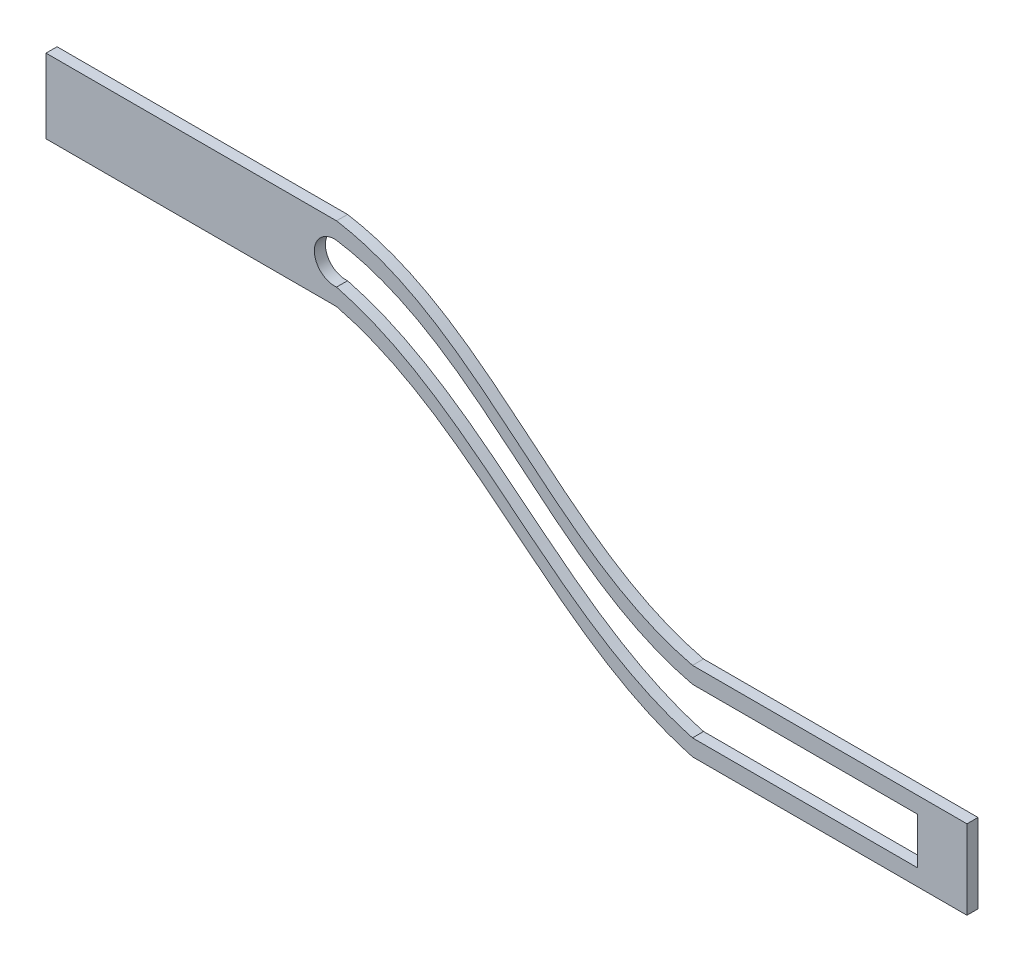
ISO-10303-21;
HEADER;
FILE_DESCRIPTION(('STEP AP214'),'2;1');
FILE_NAME('part.step','',(''),(''),'','','');
FILE_SCHEMA(('AUTOMOTIVE_DESIGN { 1 0 10303 214 1 1 1 1 }'));
ENDSEC;
DATA;
#1=APPLICATION_CONTEXT('core data for automotive mechanical design processes');
#2=APPLICATION_PROTOCOL_DEFINITION('international standard','automotive_design',2000,#1);
#3=PRODUCT_CONTEXT('',#1,'mechanical');
#4=PRODUCT('Part','Part','',(#3));
#5=PRODUCT_RELATED_PRODUCT_CATEGORY('part','',(#4));
#6=PRODUCT_DEFINITION_FORMATION('','',#4);
#7=PRODUCT_DEFINITION_CONTEXT('part definition',#1,'design');
#8=PRODUCT_DEFINITION('design','',#6,#7);
#9=PRODUCT_DEFINITION_SHAPE('','',#8);
#10=(LENGTH_UNIT() NAMED_UNIT(*) SI_UNIT(.MILLI.,.METRE.));
#11=(NAMED_UNIT(*) PLANE_ANGLE_UNIT() SI_UNIT($,.RADIAN.));
#12=(NAMED_UNIT(*) SI_UNIT($,.STERADIAN.) SOLID_ANGLE_UNIT());
#13=UNCERTAINTY_MEASURE_WITH_UNIT(LENGTH_MEASURE(1.E-05),#10,'distance_accuracy_value','');
#14=(GEOMETRIC_REPRESENTATION_CONTEXT(3) GLOBAL_UNCERTAINTY_ASSIGNED_CONTEXT((#13)) GLOBAL_UNIT_ASSIGNED_CONTEXT((#10,
#11,#12)) REPRESENTATION_CONTEXT('',''));
#15=CARTESIAN_POINT('',(0.,0.,0.));
#16=DIRECTION('',(0.,0.,1.));
#17=DIRECTION('',(1.,0.,0.));
#18=AXIS2_PLACEMENT_3D('',#15,#16,#17);
#19=CARTESIAN_POINT('',(-122.264976342082,9.57643260683997,3.8));
#20=DIRECTION('',(0.,0.,1.));
#21=DIRECTION('',(1.,0.,0.));
#22=AXIS2_PLACEMENT_3D('',#19,#20,#21);
#23=PLANE('',#22);
#24=CARTESIAN_POINT('',(-183.434400526854,45.6712423685026,3.8));
#25=CARTESIAN_POINT('',(-135.823073524928,33.7105717836941,3.8));
#26=CARTESIAN_POINT('',(-108.755954442638,-14.3126069948659,3.8));
#27=CARTESIAN_POINT('',(-60.9483263071004,-27.2536758802677,3.8));
#28=B_SPLINE_CURVE_WITH_KNOTS('',3,(#24,#25,#26,#27),.UNSPECIFIED.,.F.,.F.,(4,4),(0.,1.),.UNSPECIFIED.);
#29=CARTESIAN_POINT('',(-183.434400526854,45.6712423685026,3.8));
#30=VERTEX_POINT('',#29);
#31=CARTESIAN_POINT('',(-60.9483263071004,-27.2536758802677,3.8));
#32=VERTEX_POINT('',#31);
#33=EDGE_CURVE('E277',#30,#32,#28,.T.);
#34=ORIENTED_EDGE('',*,*,#33,.T.);
#35=DIRECTION('',(1.,0.,0.));
#36=VECTOR('',#35,1.);
#37=CARTESIAN_POINT('',(-60.9483263071004,-27.2536758802677,3.8));
#38=LINE('',#37,#36);
#39=CARTESIAN_POINT('',(33.4854762271632,-27.2536758802676,3.8));
#40=VERTEX_POINT('',#39);
#41=EDGE_CURVE('E325',#32,#40,#38,.T.);
#42=ORIENTED_EDGE('',*,*,#41,.T.);
#43=DIRECTION('',(0.,1.,0.));
#44=VECTOR('',#43,1.);
#45=CARTESIAN_POINT('',(33.4854762271632,-27.2536758802676,3.8));
#46=LINE('',#45,#44);
#47=CARTESIAN_POINT('',(33.4854762271632,0.,3.8));
#48=VERTEX_POINT('',#47);
#49=EDGE_CURVE('E308',#40,#48,#46,.T.);
#50=ORIENTED_EDGE('',*,*,#49,.T.);
#51=DIRECTION('',(-1.,0.,0.));
#52=VECTOR('',#51,1.);
#53=CARTESIAN_POINT('',(33.4854762271632,0.,3.8));
#54=LINE('',#53,#52);
#55=CARTESIAN_POINT('',(-60.9483263071006,0.,3.8));
#56=VERTEX_POINT('',#55);
#57=EDGE_CURVE('E229',#48,#56,#54,.T.);
#58=ORIENTED_EDGE('',*,*,#57,.T.);
#59=CARTESIAN_POINT('',(-60.9483263071006,0.,3.8));
#60=CARTESIAN_POINT('',(-109.10583805191,11.4344909669116,3.8));
#61=CARTESIAN_POINT('',(-134.596760432405,63.2419600110928,3.8));
#62=CARTESIAN_POINT('',(-183.434400526854,71.2181628076457,3.8));
#63=B_SPLINE_CURVE_WITH_KNOTS('',3,(#59,#60,#61,#62),.UNSPECIFIED.,.F.,.F.,(4,4),(0.,1.),.UNSPECIFIED.);
#64=CARTESIAN_POINT('',(-183.434400526854,71.2181628076457,3.8));
#65=VERTEX_POINT('',#64);
#66=EDGE_CURVE('E221',#56,#65,#63,.T.);
#67=ORIENTED_EDGE('',*,*,#66,.T.);
#68=DIRECTION('',(-1.,0.,0.));
#69=VECTOR('',#68,1.);
#70=CARTESIAN_POINT('',(-183.434400526854,71.2181628076457,3.8));
#71=LINE('',#70,#69);
#72=CARTESIAN_POINT('',(-283.388111119401,71.2181628076456,3.8));
#73=VERTEX_POINT('',#72);
#74=EDGE_CURVE('E228',#65,#73,#71,.T.);
#75=ORIENTED_EDGE('',*,*,#74,.T.);
#76=DIRECTION('',(0.,-1.,0.));
#77=VECTOR('',#76,1.);
#78=CARTESIAN_POINT('',(-283.388111119401,45.6712423685026,3.8));
#79=LINE('',#78,#77);
#80=CARTESIAN_POINT('',(-283.388111119401,45.6712423685026,3.8));
#81=VERTEX_POINT('',#80);
#82=EDGE_CURVE('E236',#73,#81,#79,.T.);
#83=ORIENTED_EDGE('',*,*,#82,.T.);
#84=DIRECTION('',(1.,0.,0.));
#85=VECTOR('',#84,1.);
#86=CARTESIAN_POINT('',(-183.434400526854,45.6712423685026,3.8));
#87=LINE('',#86,#85);
#88=EDGE_CURVE('E239',#81,#30,#87,.T.);
#89=ORIENTED_EDGE('',*,*,#88,.T.);
#90=EDGE_LOOP('',(#34,#42,#50,#58,#67,#75,#83,#89));
#91=FACE_BOUND('',#90,.T.);
#92=DIRECTION('',(-1.,0.,0.));
#93=VECTOR('',#92,1.);
#94=CARTESIAN_POINT('',(16.4159482600943,-5.64540428948359,3.8));
#95=LINE('',#94,#93);
#96=CARTESIAN_POINT('',(16.4159482600943,-5.64540428948359,3.8));
#97=VERTEX_POINT('',#96);
#98=CARTESIAN_POINT('',(-60.9483263071005,-5.64540428948358,3.8));
#99=VERTEX_POINT('',#98);
#100=EDGE_CURVE('E155',#97,#99,#95,.T.);
#101=ORIENTED_EDGE('',*,*,#100,.F.);
#102=DIRECTION('',(0.,1.,0.));
#103=VECTOR('',#102,1.);
#104=CARTESIAN_POINT('',(16.4159482600943,-21.6082715907344,3.8));
#105=LINE('',#104,#103);
#106=CARTESIAN_POINT('',(16.4159482600943,-21.6082715907344,3.8));
#107=VERTEX_POINT('',#106);
#108=EDGE_CURVE('E146',#107,#97,#105,.T.);
#109=ORIENTED_EDGE('',*,*,#108,.F.);
#110=DIRECTION('',(1.,0.,0.));
#111=VECTOR('',#110,1.);
#112=CARTESIAN_POINT('',(-60.9483263071005,-21.6082715907344,3.8));
#113=LINE('',#112,#111);
#114=CARTESIAN_POINT('',(-60.9483263071005,-21.6082715907344,3.8));
#115=VERTEX_POINT('',#114);
#116=EDGE_CURVE('E348',#115,#107,#113,.T.);
#117=ORIENTED_EDGE('',*,*,#116,.F.);
#118=CARTESIAN_POINT('',(-183.434400526854,51.4712423685026,3.8));
#119=CARTESIAN_POINT('',(-135.942087972286,39.1600566312224,3.8));
#120=CARTESIAN_POINT('',(-108.723006616755,-8.53537540715716,3.8));
#121=CARTESIAN_POINT('',(-60.9483263071005,-21.6082715907344,3.8));
#122=B_SPLINE_CURVE_WITH_KNOTS('',3,(#118,#119,#120,#121),.UNSPECIFIED.,.F.,.F.,(4,4),(0.,1.),.UNSPECIFIED.);
#123=CARTESIAN_POINT('',(-183.434400526854,51.4712423685026,3.8));
#124=VERTEX_POINT('',#123);
#125=EDGE_CURVE('E379',#124,#115,#122,.T.);
#126=ORIENTED_EDGE('',*,*,#125,.F.);
#127=CARTESIAN_POINT('',(-184.043377181622,58.4447025880741,3.8));
#128=DIRECTION('',(0.,0.,1.));
#129=DIRECTION('',(1.,0.,0.));
#130=AXIS2_PLACEMENT_3D('',#127,#128,#129);
#131=CIRCLE('',#130,7.00000000000001);
#132=CARTESIAN_POINT('',(-183.434400526854,65.4181628076457,3.8));
#133=VERTEX_POINT('',#132);
#134=EDGE_CURVE('E173',#133,#124,#131,.T.);
#135=ORIENTED_EDGE('',*,*,#134,.F.);
#136=CARTESIAN_POINT('',(-60.9483263071005,-5.64540428948358,3.8));
#137=CARTESIAN_POINT('',(-109.135947227513,5.64820532989077,3.8));
#138=CARTESIAN_POINT('',(-134.494216102307,57.8130870749883,3.8));
#139=CARTESIAN_POINT('',(-183.434400526854,65.4181628076457,3.8));
#140=B_SPLINE_CURVE_WITH_KNOTS('',3,(#136,#137,#138,#139),.UNSPECIFIED.,.F.,.F.,(4,4),(0.,1.),.UNSPECIFIED.);
#141=EDGE_CURVE('E169',#99,#133,#140,.T.);
#142=ORIENTED_EDGE('',*,*,#141,.F.);
#143=EDGE_LOOP('',(#101,#109,#117,#126,#135,#142));
#144=FACE_BOUND('',#143,.T.);
#145=ADVANCED_FACE('F43',(#91,#144),#23,.T.);
#146=CARTESIAN_POINT('',(-122.264976342082,9.57643260683997,0.));
#147=DIRECTION('',(0.,0.,1.));
#148=DIRECTION('',(1.,0.,0.));
#149=AXIS2_PLACEMENT_3D('',#146,#147,#148);
#150=PLANE('',#149);
#151=CARTESIAN_POINT('',(-183.434400526854,45.6712423685026,0.));
#152=CARTESIAN_POINT('',(-135.823073524928,33.7105717836941,0.));
#153=CARTESIAN_POINT('',(-108.755954442638,-14.3126069948659,0.));
#154=CARTESIAN_POINT('',(-60.9483263071004,-27.2536758802677,0.));
#155=B_SPLINE_CURVE_WITH_KNOTS('',3,(#151,#152,#153,#154),.UNSPECIFIED.,.F.,.F.,(4,4),(0.,1.),.UNSPECIFIED.);
#156=CARTESIAN_POINT('',(-183.434400526854,45.6712423685026,0.));
#157=VERTEX_POINT('',#156);
#158=CARTESIAN_POINT('',(-60.9483263071004,-27.2536758802677,0.));
#159=VERTEX_POINT('',#158);
#160=EDGE_CURVE('E164',#157,#159,#155,.T.);
#161=ORIENTED_EDGE('',*,*,#160,.F.);
#162=DIRECTION('',(1.,0.,0.));
#163=VECTOR('',#162,1.);
#164=CARTESIAN_POINT('',(-183.434400526854,45.6712423685026,0.));
#165=LINE('',#164,#163);
#166=CARTESIAN_POINT('',(-283.388111119401,45.6712423685026,0.));
#167=VERTEX_POINT('',#166);
#168=EDGE_CURVE('E274',#167,#157,#165,.T.);
#169=ORIENTED_EDGE('',*,*,#168,.F.);
#170=DIRECTION('',(0.,-1.,0.));
#171=VECTOR('',#170,1.);
#172=CARTESIAN_POINT('',(-283.388111119401,45.6712423685026,0.));
#173=LINE('',#172,#171);
#174=CARTESIAN_POINT('',(-283.388111119401,71.2181628076456,0.));
#175=VERTEX_POINT('',#174);
#176=EDGE_CURVE('E271',#175,#167,#173,.T.);
#177=ORIENTED_EDGE('',*,*,#176,.F.);
#178=DIRECTION('',(-1.,0.,0.));
#179=VECTOR('',#178,1.);
#180=CARTESIAN_POINT('',(-183.434400526854,71.2181628076457,0.));
#181=LINE('',#180,#179);
#182=CARTESIAN_POINT('',(-183.434400526854,71.2181628076457,0.));
#183=VERTEX_POINT('',#182);
#184=EDGE_CURVE('E265',#183,#175,#181,.T.);
#185=ORIENTED_EDGE('',*,*,#184,.F.);
#186=CARTESIAN_POINT('',(-60.9483263071006,0.,0.));
#187=CARTESIAN_POINT('',(-109.10583805191,11.4344909669116,0.));
#188=CARTESIAN_POINT('',(-134.596760432405,63.2419600110928,0.));
#189=CARTESIAN_POINT('',(-183.434400526854,71.2181628076457,0.));
#190=B_SPLINE_CURVE_WITH_KNOTS('',3,(#186,#187,#188,#189),.UNSPECIFIED.,.F.,.F.,(4,4),(0.,1.),.UNSPECIFIED.);
#191=CARTESIAN_POINT('',(-60.9483263071006,0.,0.));
#192=VERTEX_POINT('',#191);
#193=EDGE_CURVE('E260',#192,#183,#190,.T.);
#194=ORIENTED_EDGE('',*,*,#193,.F.);
#195=DIRECTION('',(-1.,0.,0.));
#196=VECTOR('',#195,1.);
#197=CARTESIAN_POINT('',(33.4854762271632,0.,0.));
#198=LINE('',#197,#196);
#199=CARTESIAN_POINT('',(33.4854762271632,0.,0.));
#200=VERTEX_POINT('',#199);
#201=EDGE_CURVE('E257',#200,#192,#198,.T.);
#202=ORIENTED_EDGE('',*,*,#201,.F.);
#203=DIRECTION('',(0.,1.,0.));
#204=VECTOR('',#203,1.);
#205=CARTESIAN_POINT('',(33.4854762271632,-27.2536758802676,0.));
#206=LINE('',#205,#204);
#207=CARTESIAN_POINT('',(33.4854762271632,-27.2536758802676,0.));
#208=VERTEX_POINT('',#207);
#209=EDGE_CURVE('E254',#208,#200,#206,.T.);
#210=ORIENTED_EDGE('',*,*,#209,.F.);
#211=DIRECTION('',(1.,0.,0.));
#212=VECTOR('',#211,1.);
#213=CARTESIAN_POINT('',(-60.9483263071004,-27.2536758802677,0.));
#214=LINE('',#213,#212);
#215=EDGE_CURVE('E248',#159,#208,#214,.T.);
#216=ORIENTED_EDGE('',*,*,#215,.F.);
#217=EDGE_LOOP('',(#161,#169,#177,#185,#194,#202,#210,#216));
#218=FACE_BOUND('',#217,.T.);
#219=DIRECTION('',(0.,1.,0.));
#220=VECTOR('',#219,1.);
#221=CARTESIAN_POINT('',(16.4159482600943,-21.6082715907344,0.));
#222=LINE('',#221,#220);
#223=CARTESIAN_POINT('',(16.4159482600943,-21.6082715907344,0.));
#224=VERTEX_POINT('',#223);
#225=CARTESIAN_POINT('',(16.4159482600943,-5.64540428948359,0.));
#226=VERTEX_POINT('',#225);
#227=EDGE_CURVE('E68',#224,#226,#222,.T.);
#228=ORIENTED_EDGE('',*,*,#227,.T.);
#229=DIRECTION('',(-1.,0.,0.));
#230=VECTOR('',#229,1.);
#231=CARTESIAN_POINT('',(16.4159482600943,-5.64540428948359,0.));
#232=LINE('',#231,#230);
#233=CARTESIAN_POINT('',(-60.9483263071005,-5.64540428948358,0.));
#234=VERTEX_POINT('',#233);
#235=EDGE_CURVE('E162',#226,#234,#232,.T.);
#236=ORIENTED_EDGE('',*,*,#235,.T.);
#237=CARTESIAN_POINT('',(-60.9483263071005,-5.64540428948358,0.));
#238=CARTESIAN_POINT('',(-109.135947227513,5.64820532989077,0.));
#239=CARTESIAN_POINT('',(-134.494216102307,57.8130870749883,0.));
#240=CARTESIAN_POINT('',(-183.434400526854,65.4181628076457,0.));
#241=B_SPLINE_CURVE_WITH_KNOTS('',3,(#237,#238,#239,#240),.UNSPECIFIED.,.F.,.F.,(4,4),(0.,1.),.UNSPECIFIED.);
#242=CARTESIAN_POINT('',(-183.434400526854,65.4181628076457,0.));
#243=VERTEX_POINT('',#242);
#244=EDGE_CURVE('E365',#234,#243,#241,.T.);
#245=ORIENTED_EDGE('',*,*,#244,.T.);
#246=CARTESIAN_POINT('',(-184.043377181622,58.4447025880741,0.));
#247=DIRECTION('',(0.,0.,1.));
#248=DIRECTION('',(1.,0.,0.));
#249=AXIS2_PLACEMENT_3D('',#246,#247,#248);
#250=CIRCLE('',#249,7.00000000000001);
#251=CARTESIAN_POINT('',(-183.434400526854,51.4712423685026,0.));
#252=VERTEX_POINT('',#251);
#253=EDGE_CURVE('E358',#243,#252,#250,.T.);
#254=ORIENTED_EDGE('',*,*,#253,.T.);
#255=CARTESIAN_POINT('',(-183.434400526854,51.4712423685026,0.));
#256=CARTESIAN_POINT('',(-135.942087972286,39.1600566312224,0.));
#257=CARTESIAN_POINT('',(-108.723006616755,-8.53537540715716,0.));
#258=CARTESIAN_POINT('',(-60.9483263071005,-21.6082715907344,0.));
#259=B_SPLINE_CURVE_WITH_KNOTS('',3,(#255,#256,#257,#258),.UNSPECIFIED.,.F.,.F.,(4,4),(0.,1.),.UNSPECIFIED.);
#260=CARTESIAN_POINT('',(-60.9483263071005,-21.6082715907344,0.));
#261=VERTEX_POINT('',#260);
#262=EDGE_CURVE('E352',#252,#261,#259,.T.);
#263=ORIENTED_EDGE('',*,*,#262,.T.);
#264=DIRECTION('',(1.,0.,0.));
#265=VECTOR('',#264,1.);
#266=CARTESIAN_POINT('',(-60.9483263071005,-21.6082715907344,0.));
#267=LINE('',#266,#265);
#268=EDGE_CURVE('E156',#261,#224,#267,.T.);
#269=ORIENTED_EDGE('',*,*,#268,.T.);
#270=EDGE_LOOP('',(#228,#236,#245,#254,#263,#269));
#271=FACE_BOUND('',#270,.T.);
#272=ADVANCED_FACE('F198',(#218,#271),#150,.F.);
#273=DIRECTION('',(0.,0.,-1.));
#274=VECTOR('',#273,1.);
#275=SURFACE_OF_LINEAR_EXTRUSION('',#28,#274);
#276=ORIENTED_EDGE('',*,*,#160,.T.);
#277=DIRECTION('',(0.,0.,-1.));
#278=VECTOR('',#277,1.);
#279=CARTESIAN_POINT('',(-60.9483263071004,-27.2536758802677,3.8));
#280=LINE('',#279,#278);
#281=EDGE_CURVE('E11',#32,#159,#280,.T.);
#282=ORIENTED_EDGE('',*,*,#281,.F.);
#283=ORIENTED_EDGE('',*,*,#33,.F.);
#284=DIRECTION('',(0.,0.,-1.));
#285=VECTOR('',#284,1.);
#286=CARTESIAN_POINT('',(-183.434400526854,45.6712423685026,3.8));
#287=LINE('',#286,#285);
#288=EDGE_CURVE('E242',#30,#157,#287,.T.);
#289=ORIENTED_EDGE('',*,*,#288,.T.);
#290=EDGE_LOOP('',(#276,#282,#283,#289));
#291=FACE_BOUND('',#290,.T.);
#292=ADVANCED_FACE('F45',(#291),#275,.F.);
#293=CARTESIAN_POINT('',(-60.9483263071004,-27.2536758802677,3.8));
#294=DIRECTION('',(0.,1.,0.));
#295=DIRECTION('',(-1.,0.,0.));
#296=AXIS2_PLACEMENT_3D('',#293,#294,#295);
#297=PLANE('',#296);
#298=ORIENTED_EDGE('',*,*,#215,.T.);
#299=DIRECTION('',(0.,0.,-1.));
#300=VECTOR('',#299,1.);
#301=CARTESIAN_POINT('',(33.4854762271632,-27.2536758802676,3.8));
#302=LINE('',#301,#300);
#303=EDGE_CURVE('E53',#40,#208,#302,.T.);
#304=ORIENTED_EDGE('',*,*,#303,.F.);
#305=ORIENTED_EDGE('',*,*,#41,.F.);
#306=ORIENTED_EDGE('',*,*,#281,.T.);
#307=EDGE_LOOP('',(#298,#304,#305,#306));
#308=FACE_BOUND('',#307,.T.);
#309=ADVANCED_FACE('F481',(#308),#297,.F.);
#310=CARTESIAN_POINT('',(33.4854762271632,-27.2536758802676,3.8));
#311=DIRECTION('',(-1.,0.,0.));
#312=DIRECTION('',(0.,-1.,0.));
#313=AXIS2_PLACEMENT_3D('',#310,#311,#312);
#314=PLANE('',#313);
#315=ORIENTED_EDGE('',*,*,#209,.T.);
#316=DIRECTION('',(0.,0.,-1.));
#317=VECTOR('',#316,1.);
#318=CARTESIAN_POINT('',(33.4854762271632,0.,3.8));
#319=LINE('',#318,#317);
#320=EDGE_CURVE('E297',#48,#200,#319,.T.);
#321=ORIENTED_EDGE('',*,*,#320,.F.);
#322=ORIENTED_EDGE('',*,*,#49,.F.);
#323=ORIENTED_EDGE('',*,*,#303,.T.);
#324=EDGE_LOOP('',(#315,#321,#322,#323));
#325=FACE_BOUND('',#324,.T.);
#326=ADVANCED_FACE('F306',(#325),#314,.F.);
#327=CARTESIAN_POINT('',(33.4854762271632,0.,3.8));
#328=DIRECTION('',(0.,-1.,0.));
#329=DIRECTION('',(1.,0.,0.));
#330=AXIS2_PLACEMENT_3D('',#327,#328,#329);
#331=PLANE('',#330);
#332=ORIENTED_EDGE('',*,*,#201,.T.);
#333=DIRECTION('',(0.,0.,-1.));
#334=VECTOR('',#333,1.);
#335=CARTESIAN_POINT('',(-60.9483263071006,0.,3.8));
#336=LINE('',#335,#334);
#337=EDGE_CURVE('E293',#56,#192,#336,.T.);
#338=ORIENTED_EDGE('',*,*,#337,.F.);
#339=ORIENTED_EDGE('',*,*,#57,.F.);
#340=ORIENTED_EDGE('',*,*,#320,.T.);
#341=EDGE_LOOP('',(#332,#338,#339,#340));
#342=FACE_BOUND('',#341,.T.);
#343=ADVANCED_FACE('F218',(#342),#331,.F.);
#344=DIRECTION('',(0.,0.,-1.));
#345=VECTOR('',#344,1.);
#346=SURFACE_OF_LINEAR_EXTRUSION('',#63,#345);
#347=ORIENTED_EDGE('',*,*,#193,.T.);
#348=DIRECTION('',(0.,0.,-1.));
#349=VECTOR('',#348,1.);
#350=CARTESIAN_POINT('',(-183.434400526854,71.2181628076457,3.8));
#351=LINE('',#350,#349);
#352=EDGE_CURVE('E289',#65,#183,#351,.T.);
#353=ORIENTED_EDGE('',*,*,#352,.F.);
#354=ORIENTED_EDGE('',*,*,#66,.F.);
#355=ORIENTED_EDGE('',*,*,#337,.T.);
#356=EDGE_LOOP('',(#347,#353,#354,#355));
#357=FACE_BOUND('',#356,.T.);
#358=ADVANCED_FACE('F213',(#357),#346,.F.);
#359=CARTESIAN_POINT('',(-183.434400526854,71.2181628076457,3.8));
#360=DIRECTION('',(0.,-1.,0.));
#361=DIRECTION('',(1.,0.,0.));
#362=AXIS2_PLACEMENT_3D('',#359,#360,#361);
#363=PLANE('',#362);
#364=ORIENTED_EDGE('',*,*,#184,.T.);
#365=DIRECTION('',(0.,0.,-1.));
#366=VECTOR('',#365,1.);
#367=CARTESIAN_POINT('',(-283.388111119401,71.2181628076456,3.8));
#368=LINE('',#367,#366);
#369=EDGE_CURVE('E285',#73,#175,#368,.T.);
#370=ORIENTED_EDGE('',*,*,#369,.F.);
#371=ORIENTED_EDGE('',*,*,#74,.F.);
#372=ORIENTED_EDGE('',*,*,#352,.T.);
#373=EDGE_LOOP('',(#364,#370,#371,#372));
#374=FACE_BOUND('',#373,.T.);
#375=ADVANCED_FACE('F209',(#374),#363,.F.);
#376=CARTESIAN_POINT('',(-283.388111119401,45.6712423685026,3.8));
#377=DIRECTION('',(1.,0.,0.));
#378=DIRECTION('',(0.,0.,-1.));
#379=AXIS2_PLACEMENT_3D('',#376,#377,#378);
#380=PLANE('',#379);
#381=ORIENTED_EDGE('',*,*,#176,.T.);
#382=DIRECTION('',(0.,0.,-1.));
#383=VECTOR('',#382,1.);
#384=CARTESIAN_POINT('',(-283.388111119401,45.6712423685026,3.8));
#385=LINE('',#384,#383);
#386=EDGE_CURVE('E281',#81,#167,#385,.T.);
#387=ORIENTED_EDGE('',*,*,#386,.F.);
#388=ORIENTED_EDGE('',*,*,#82,.F.);
#389=ORIENTED_EDGE('',*,*,#369,.T.);
#390=EDGE_LOOP('',(#381,#387,#388,#389));
#391=FACE_BOUND('',#390,.T.);
#392=ADVANCED_FACE('F205',(#391),#380,.F.);
#393=CARTESIAN_POINT('',(-183.434400526854,45.6712423685026,3.8));
#394=DIRECTION('',(0.,1.,0.));
#395=DIRECTION('',(-1.,0.,0.));
#396=AXIS2_PLACEMENT_3D('',#393,#394,#395);
#397=PLANE('',#396);
#398=ORIENTED_EDGE('',*,*,#168,.T.);
#399=ORIENTED_EDGE('',*,*,#288,.F.);
#400=ORIENTED_EDGE('',*,*,#88,.F.);
#401=ORIENTED_EDGE('',*,*,#386,.T.);
#402=EDGE_LOOP('',(#398,#399,#400,#401));
#403=FACE_BOUND('',#402,.T.);
#404=ADVANCED_FACE('F195',(#403),#397,.F.);
#405=CARTESIAN_POINT('',(16.4159482600943,-21.6082715907344,3.8));
#406=DIRECTION('',(-1.,0.,0.));
#407=DIRECTION('',(0.,0.,1.));
#408=AXIS2_PLACEMENT_3D('',#405,#406,#407);
#409=PLANE('',#408);
#410=ORIENTED_EDGE('',*,*,#227,.F.);
#411=DIRECTION('',(0.,0.,-1.));
#412=VECTOR('',#411,1.);
#413=CARTESIAN_POINT('',(16.4159482600943,-21.6082715907344,3.8));
#414=LINE('',#413,#412);
#415=EDGE_CURVE('E150',#107,#224,#414,.T.);
#416=ORIENTED_EDGE('',*,*,#415,.F.);
#417=ORIENTED_EDGE('',*,*,#108,.T.);
#418=DIRECTION('',(0.,0.,-1.));
#419=VECTOR('',#418,1.);
#420=CARTESIAN_POINT('',(16.4159482600943,-5.64540428948359,3.8));
#421=LINE('',#420,#419);
#422=EDGE_CURVE('E149',#97,#226,#421,.T.);
#423=ORIENTED_EDGE('',*,*,#422,.T.);
#424=EDGE_LOOP('',(#410,#416,#417,#423));
#425=FACE_BOUND('',#424,.T.);
#426=ADVANCED_FACE('F148',(#425),#409,.T.);
#427=CARTESIAN_POINT('',(16.4159482600943,-5.64540428948359,3.8));
#428=DIRECTION('',(0.,-1.,0.));
#429=DIRECTION('',(1.,0.,0.));
#430=AXIS2_PLACEMENT_3D('',#427,#428,#429);
#431=PLANE('',#430);
#432=ORIENTED_EDGE('',*,*,#235,.F.);
#433=ORIENTED_EDGE('',*,*,#422,.F.);
#434=ORIENTED_EDGE('',*,*,#100,.T.);
#435=DIRECTION('',(0.,0.,-1.));
#436=VECTOR('',#435,1.);
#437=CARTESIAN_POINT('',(-60.9483263071005,-5.64540428948358,3.8));
#438=LINE('',#437,#436);
#439=EDGE_CURVE('E165',#99,#234,#438,.T.);
#440=ORIENTED_EDGE('',*,*,#439,.T.);
#441=EDGE_LOOP('',(#432,#433,#434,#440));
#442=FACE_BOUND('',#441,.T.);
#443=ADVANCED_FACE('F159',(#442),#431,.T.);
#444=DIRECTION('',(0.,0.,-1.));
#445=VECTOR('',#444,1.);
#446=SURFACE_OF_LINEAR_EXTRUSION('',#140,#445);
#447=ORIENTED_EDGE('',*,*,#244,.F.);
#448=ORIENTED_EDGE('',*,*,#439,.F.);
#449=ORIENTED_EDGE('',*,*,#141,.T.);
#450=DIRECTION('',(0.,0.,-1.));
#451=VECTOR('',#450,1.);
#452=CARTESIAN_POINT('',(-183.434400526854,65.4181628076457,3.8));
#453=LINE('',#452,#451);
#454=EDGE_CURVE('E338',#133,#243,#453,.T.);
#455=ORIENTED_EDGE('',*,*,#454,.T.);
#456=EDGE_LOOP('',(#447,#448,#449,#455));
#457=FACE_BOUND('',#456,.T.);
#458=ADVANCED_FACE('F184',(#457),#446,.T.);
#459=CARTESIAN_POINT('',(-184.043377181622,58.4447025880741,3.8));
#460=DIRECTION('',(0.,0.,-1.));
#461=DIRECTION('',(-1.,0.,0.));
#462=AXIS2_PLACEMENT_3D('',#459,#460,#461);
#463=CYLINDRICAL_SURFACE('',#462,7.00000000000001);
#464=ORIENTED_EDGE('',*,*,#253,.F.);
#465=ORIENTED_EDGE('',*,*,#454,.F.);
#466=ORIENTED_EDGE('',*,*,#134,.T.);
#467=DIRECTION('',(0.,0.,-1.));
#468=VECTOR('',#467,1.);
#469=CARTESIAN_POINT('',(-183.434400526854,51.4712423685026,3.8));
#470=LINE('',#469,#468);
#471=EDGE_CURVE('E341',#124,#252,#470,.T.);
#472=ORIENTED_EDGE('',*,*,#471,.T.);
#473=EDGE_LOOP('',(#464,#465,#466,#472));
#474=FACE_BOUND('',#473,.T.);
#475=ADVANCED_FACE('F188',(#474),#463,.F.);
#476=DIRECTION('',(0.,0.,-1.));
#477=VECTOR('',#476,1.);
#478=SURFACE_OF_LINEAR_EXTRUSION('',#122,#477);
#479=ORIENTED_EDGE('',*,*,#262,.F.);
#480=ORIENTED_EDGE('',*,*,#471,.F.);
#481=ORIENTED_EDGE('',*,*,#125,.T.);
#482=DIRECTION('',(0.,0.,-1.));
#483=VECTOR('',#482,1.);
#484=CARTESIAN_POINT('',(-60.9483263071005,-21.6082715907344,3.8));
#485=LINE('',#484,#483);
#486=EDGE_CURVE('E60',#115,#261,#485,.T.);
#487=ORIENTED_EDGE('',*,*,#486,.T.);
#488=EDGE_LOOP('',(#479,#480,#481,#487));
#489=FACE_BOUND('',#488,.T.);
#490=ADVANCED_FACE('F387',(#489),#478,.T.);
#491=CARTESIAN_POINT('',(-60.9483263071005,-21.6082715907344,3.8));
#492=DIRECTION('',(0.,1.,0.));
#493=DIRECTION('',(0.,0.,1.));
#494=AXIS2_PLACEMENT_3D('',#491,#492,#493);
#495=PLANE('',#494);
#496=ORIENTED_EDGE('',*,*,#268,.F.);
#497=ORIENTED_EDGE('',*,*,#486,.F.);
#498=ORIENTED_EDGE('',*,*,#116,.T.);
#499=ORIENTED_EDGE('',*,*,#415,.T.);
#500=EDGE_LOOP('',(#496,#497,#498,#499));
#501=FACE_BOUND('',#500,.T.);
#502=ADVANCED_FACE('F390',(#501),#495,.T.);
#503=CLOSED_SHELL('',(#145,#272,#292,#309,#326,#343,#358,#375,#392,#404,#426,#443,#458,#475,
#490,#502));
#504=MANIFOLD_SOLID_BREP('B2',#503);
#505=ADVANCED_BREP_SHAPE_REPRESENTATION('',(#18,#504),#14);
#506=SHAPE_DEFINITION_REPRESENTATION(#9,#505);
ENDSEC;
END-ISO-10303-21;
